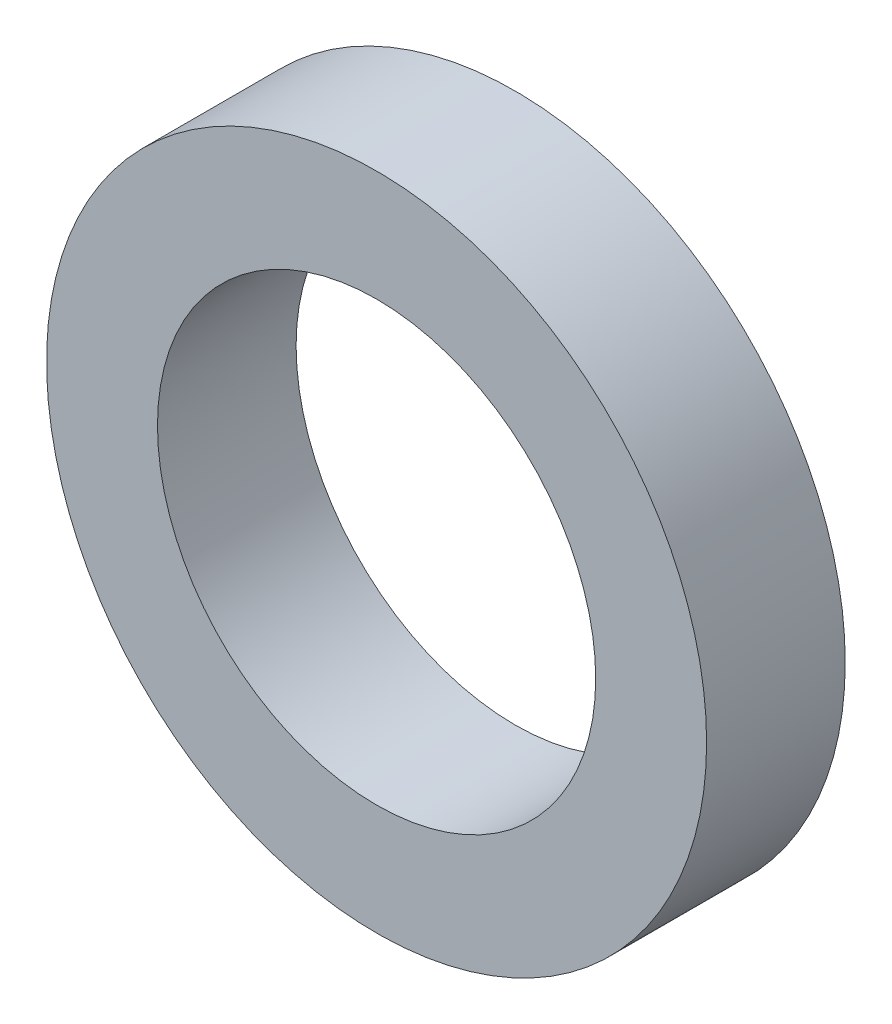
ISO-10303-21;
HEADER;
FILE_DESCRIPTION(('STEP AP214'),'2;1');
FILE_NAME('part.step','',(''),(''),'','','');
FILE_SCHEMA(('AUTOMOTIVE_DESIGN { 1 0 10303 214 1 1 1 1 }'));
ENDSEC;
DATA;
#1=APPLICATION_CONTEXT('core data for automotive mechanical design processes');
#2=APPLICATION_PROTOCOL_DEFINITION('international standard','automotive_design',2000,#1);
#3=PRODUCT_CONTEXT('',#1,'mechanical');
#4=PRODUCT('Part','Part','',(#3));
#5=PRODUCT_RELATED_PRODUCT_CATEGORY('part','',(#4));
#6=PRODUCT_DEFINITION_FORMATION('','',#4);
#7=PRODUCT_DEFINITION_CONTEXT('part definition',#1,'design');
#8=PRODUCT_DEFINITION('design','',#6,#7);
#9=PRODUCT_DEFINITION_SHAPE('','',#8);
#10=(LENGTH_UNIT() NAMED_UNIT(*) SI_UNIT(.MILLI.,.METRE.));
#11=(NAMED_UNIT(*) PLANE_ANGLE_UNIT() SI_UNIT($,.RADIAN.));
#12=(NAMED_UNIT(*) SI_UNIT($,.STERADIAN.) SOLID_ANGLE_UNIT());
#13=UNCERTAINTY_MEASURE_WITH_UNIT(LENGTH_MEASURE(1.E-05),#10,'distance_accuracy_value','');
#14=(GEOMETRIC_REPRESENTATION_CONTEXT(3) GLOBAL_UNCERTAINTY_ASSIGNED_CONTEXT((#13)) GLOBAL_UNIT_ASSIGNED_CONTEXT((#10,
#11,#12)) REPRESENTATION_CONTEXT('',''));
#15=CARTESIAN_POINT('',(0.,0.,0.));
#16=DIRECTION('',(0.,0.,1.));
#17=DIRECTION('',(1.,0.,0.));
#18=AXIS2_PLACEMENT_3D('',#15,#16,#17);
#19=CARTESIAN_POINT('',(0.,0.,5.));
#20=DIRECTION('',(0.,0.,1.));
#21=DIRECTION('',(1.,0.,0.));
#22=AXIS2_PLACEMENT_3D('',#19,#20,#21);
#23=PLANE('',#22);
#24=CARTESIAN_POINT('',(0.,0.,5.));
#25=DIRECTION('',(0.,0.,1.));
#26=DIRECTION('',(1.,0.,0.));
#27=AXIS2_PLACEMENT_3D('',#24,#25,#26);
#28=CIRCLE('',#27,11.903);
#29=CARTESIAN_POINT('',(11.903,0.,5.));
#30=VERTEX_POINT('',#29);
#31=EDGE_CURVE('E10',#30,#30,#28,.T.);
#32=ORIENTED_EDGE('',*,*,#31,.T.);
#33=EDGE_LOOP('',(#32));
#34=FACE_BOUND('',#33,.T.);
#35=CARTESIAN_POINT('',(0.,0.,5.));
#36=DIRECTION('',(0.,0.,1.));
#37=DIRECTION('',(1.,0.,0.));
#38=AXIS2_PLACEMENT_3D('',#35,#36,#37);
#39=CIRCLE('',#38,7.903);
#40=CARTESIAN_POINT('',(7.903,0.,5.));
#41=VERTEX_POINT('',#40);
#42=EDGE_CURVE('E41',#41,#41,#39,.T.);
#43=ORIENTED_EDGE('',*,*,#42,.F.);
#44=EDGE_LOOP('',(#43));
#45=FACE_BOUND('',#44,.T.);
#46=ADVANCED_FACE('F30',(#34,#45),#23,.T.);
#47=CARTESIAN_POINT('',(0.,0.,0.));
#48=DIRECTION('',(0.,0.,1.));
#49=DIRECTION('',(1.,0.,0.));
#50=AXIS2_PLACEMENT_3D('',#47,#48,#49);
#51=PLANE('',#50);
#52=CARTESIAN_POINT('',(0.,0.,0.));
#53=DIRECTION('',(0.,0.,1.));
#54=DIRECTION('',(1.,0.,0.));
#55=AXIS2_PLACEMENT_3D('',#52,#53,#54);
#56=CIRCLE('',#55,11.903);
#57=CARTESIAN_POINT('',(11.903,0.,0.));
#58=VERTEX_POINT('',#57);
#59=EDGE_CURVE('E34',#58,#58,#56,.T.);
#60=ORIENTED_EDGE('',*,*,#59,.F.);
#61=EDGE_LOOP('',(#60));
#62=FACE_BOUND('',#61,.T.);
#63=CARTESIAN_POINT('',(0.,0.,0.));
#64=DIRECTION('',(0.,0.,1.));
#65=DIRECTION('',(1.,0.,0.));
#66=AXIS2_PLACEMENT_3D('',#63,#64,#65);
#67=CIRCLE('',#66,7.903);
#68=CARTESIAN_POINT('',(7.903,0.,0.));
#69=VERTEX_POINT('',#68);
#70=EDGE_CURVE('E43',#69,#69,#67,.T.);
#71=ORIENTED_EDGE('',*,*,#70,.T.);
#72=EDGE_LOOP('',(#71));
#73=FACE_BOUND('',#72,.T.);
#74=ADVANCED_FACE('F53',(#62,#73),#51,.F.);
#75=CARTESIAN_POINT('',(0.,0.,5.));
#76=DIRECTION('',(0.,0.,-1.));
#77=DIRECTION('',(-1.,0.,0.));
#78=AXIS2_PLACEMENT_3D('',#75,#76,#77);
#79=CYLINDRICAL_SURFACE('',#78,11.903);
#80=ORIENTED_EDGE('',*,*,#31,.F.);
#81=EDGE_LOOP('',(#80));
#82=FACE_BOUND('',#81,.T.);
#83=ORIENTED_EDGE('',*,*,#59,.T.);
#84=EDGE_LOOP('',(#83));
#85=FACE_BOUND('',#84,.T.);
#86=ADVANCED_FACE('F32',(#82,#85),#79,.T.);
#87=CARTESIAN_POINT('',(0.,0.,5.));
#88=DIRECTION('',(0.,0.,-1.));
#89=DIRECTION('',(-1.,0.,0.));
#90=AXIS2_PLACEMENT_3D('',#87,#88,#89);
#91=CYLINDRICAL_SURFACE('',#90,7.903);
#92=ORIENTED_EDGE('',*,*,#42,.T.);
#93=EDGE_LOOP('',(#92));
#94=FACE_BOUND('',#93,.T.);
#95=ORIENTED_EDGE('',*,*,#70,.F.);
#96=EDGE_LOOP('',(#95));
#97=FACE_BOUND('',#96,.T.);
#98=ADVANCED_FACE('F49',(#94,#97),#91,.F.);
#99=CLOSED_SHELL('',(#46,#74,#86,#98));
#100=MANIFOLD_SOLID_BREP('B2',#99);
#101=ADVANCED_BREP_SHAPE_REPRESENTATION('',(#18,#100),#14);
#102=SHAPE_DEFINITION_REPRESENTATION(#9,#101);
ENDSEC;
END-ISO-10303-21;
